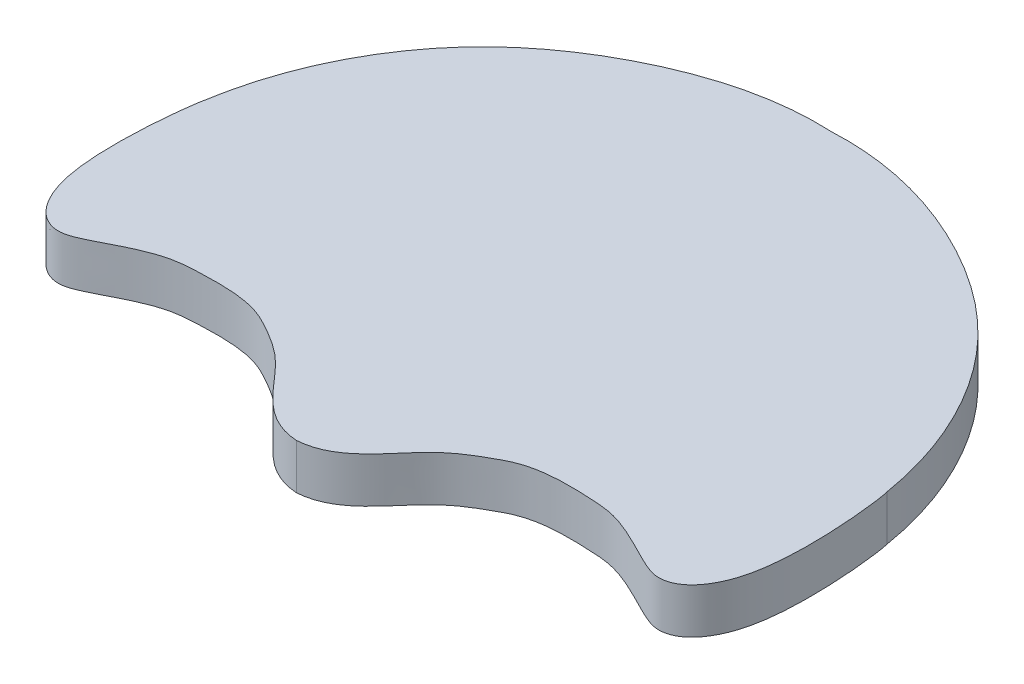
ISO-10303-21;
HEADER;
FILE_DESCRIPTION(('STEP AP214'),'2;1');
FILE_NAME('part.step','',(''),(''),'','','');
FILE_SCHEMA(('AUTOMOTIVE_DESIGN { 1 0 10303 214 1 1 1 1 }'));
ENDSEC;
DATA;
#1=APPLICATION_CONTEXT('core data for automotive mechanical design processes');
#2=APPLICATION_PROTOCOL_DEFINITION('international standard','automotive_design',2000,#1);
#3=PRODUCT_CONTEXT('',#1,'mechanical');
#4=PRODUCT('Part','Part','',(#3));
#5=PRODUCT_RELATED_PRODUCT_CATEGORY('part','',(#4));
#6=PRODUCT_DEFINITION_FORMATION('','',#4);
#7=PRODUCT_DEFINITION_CONTEXT('part definition',#1,'design');
#8=PRODUCT_DEFINITION('design','',#6,#7);
#9=PRODUCT_DEFINITION_SHAPE('','',#8);
#10=(LENGTH_UNIT() NAMED_UNIT(*) SI_UNIT(.MILLI.,.METRE.));
#11=(NAMED_UNIT(*) PLANE_ANGLE_UNIT() SI_UNIT($,.RADIAN.));
#12=(NAMED_UNIT(*) SI_UNIT($,.STERADIAN.) SOLID_ANGLE_UNIT());
#13=UNCERTAINTY_MEASURE_WITH_UNIT(LENGTH_MEASURE(1.E-05),#10,'distance_accuracy_value','');
#14=(GEOMETRIC_REPRESENTATION_CONTEXT(3) GLOBAL_UNCERTAINTY_ASSIGNED_CONTEXT((#13)) GLOBAL_UNIT_ASSIGNED_CONTEXT((#10,
#11,#12)) REPRESENTATION_CONTEXT('',''));
#15=CARTESIAN_POINT('',(0.,0.,0.));
#16=DIRECTION('',(0.,0.,1.));
#17=DIRECTION('',(1.,0.,0.));
#18=AXIS2_PLACEMENT_3D('',#15,#16,#17);
#19=CARTESIAN_POINT('',(-190.5,25.4,0.));
#20=CARTESIAN_POINT('',(-192.064011792662,25.4,4.96350192621509));
#21=CARTESIAN_POINT('',(-201.967167765924,25.4,83.3146183109833));
#22=CARTESIAN_POINT('',(-174.696602041029,25.4,109.289958804391));
#23=CARTESIAN_POINT('',(-151.630121659032,25.4,100.567984898405));
#24=CARTESIAN_POINT('',(-131.410771519055,25.4,87.7197839609674));
#25=CARTESIAN_POINT('',(-96.8435676275136,25.4,85.3754033772216));
#26=CARTESIAN_POINT('',(-78.6925101438482,25.4,86.2588274201763));
#27=CARTESIAN_POINT('',(-58.8335330715194,25.4,96.8793824699203));
#28=CARTESIAN_POINT('',(-37.3059346099107,25.4,109.935798161985));
#29=CARTESIAN_POINT('',(-21.3496139460233,25.4,139.114767456721));
#30=CARTESIAN_POINT('',(1.40754784340045E-13,25.4,140.530090072389));
#31=B_SPLINE_CURVE_WITH_KNOTS('',3,(#19,#20,#21,#22,#23,#24,#25,#26,#27,#28,#29,#30),
.UNSPECIFIED.,.F.,.F.,(4,1,1,1,1,1,1,1,1,4),(0.,0.166997051795611,0.292320514089622,
0.319633117373991,0.426735310498713,0.458914050276757,0.609241775376387,0.641909703937047,
0.766802370245909,1.),.UNSPECIFIED.);
#32=DIRECTION('',(0.,-1.,0.));
#33=VECTOR('',#32,1.);
#34=SURFACE_OF_LINEAR_EXTRUSION('',#31,#33);
#35=CARTESIAN_POINT('',(-190.5,0.,0.));
#36=CARTESIAN_POINT('',(-192.064011792662,0.,4.96350192621509));
#37=CARTESIAN_POINT('',(-201.967167765924,0.,83.3146183109833));
#38=CARTESIAN_POINT('',(-174.696602041029,0.,109.289958804391));
#39=CARTESIAN_POINT('',(-151.630121659032,0.,100.567984898405));
#40=CARTESIAN_POINT('',(-131.410771519055,0.,87.7197839609674));
#41=CARTESIAN_POINT('',(-96.8435676275136,0.,85.3754033772216));
#42=CARTESIAN_POINT('',(-78.6925101438482,0.,86.2588274201763));
#43=CARTESIAN_POINT('',(-58.8335330715194,0.,96.8793824699203));
#44=CARTESIAN_POINT('',(-37.3059346099107,0.,109.935798161985));
#45=CARTESIAN_POINT('',(-21.3496139460233,0.,139.114767456721));
#46=CARTESIAN_POINT('',(1.40754784340045E-13,0.,140.530090072389));
#47=B_SPLINE_CURVE_WITH_KNOTS('',3,(#35,#36,#37,#38,#39,#40,#41,#42,#43,#44,#45,#46),
.UNSPECIFIED.,.F.,.F.,(4,1,1,1,1,1,1,1,1,4),(0.,0.166997051795611,0.292320514089622,
0.319633117373991,0.426735310498713,0.458914050276757,0.609241775376387,0.641909703937047,
0.766802370245909,1.),.UNSPECIFIED.);
#48=CARTESIAN_POINT('',(-190.5,0.,0.));
#49=VERTEX_POINT('',#48);
#50=CARTESIAN_POINT('',(-1.06334839341837E-13,0.,140.530090072389));
#51=VERTEX_POINT('',#50);
#52=EDGE_CURVE('E134',#49,#51,#47,.T.);
#53=ORIENTED_EDGE('',*,*,#52,.T.);
#54=DIRECTION('',(0.,-1.,0.));
#55=VECTOR('',#54,1.);
#56=CARTESIAN_POINT('',(-1.06334839341837E-13,25.4,140.530090072389));
#57=LINE('',#56,#55);
#58=CARTESIAN_POINT('',(-1.06334839341837E-13,25.4,140.530090072389));
#59=VERTEX_POINT('',#58);
#60=EDGE_CURVE('E11',#59,#51,#57,.T.);
#61=ORIENTED_EDGE('',*,*,#60,.F.);
#62=CARTESIAN_POINT('',(-190.5,25.4,0.));
#63=VERTEX_POINT('',#62);
#64=EDGE_CURVE('E97',#63,#59,#31,.T.);
#65=ORIENTED_EDGE('',*,*,#64,.F.);
#66=DIRECTION('',(0.,-1.,0.));
#67=VECTOR('',#66,1.);
#68=CARTESIAN_POINT('',(-190.5,25.4,0.));
#69=LINE('',#68,#67);
#70=EDGE_CURVE('E105',#63,#49,#69,.T.);
#71=ORIENTED_EDGE('',*,*,#70,.T.);
#72=EDGE_LOOP('',(#53,#61,#65,#71));
#73=FACE_BOUND('',#72,.T.);
#74=ADVANCED_FACE('F45',(#73),#34,.F.);
#75=CARTESIAN_POINT('',(-1.06334839341837E-13,25.4,140.530090072389));
#76=CARTESIAN_POINT('',(21.3496139460233,25.4,139.114767456721));
#77=CARTESIAN_POINT('',(37.3059346099107,25.4,109.935798161984));
#78=CARTESIAN_POINT('',(58.8335330715195,25.4,96.8793824699203));
#79=CARTESIAN_POINT('',(78.6925101438482,25.4,86.2588274201763));
#80=CARTESIAN_POINT('',(96.8435676275136,25.4,85.3754033772216));
#81=CARTESIAN_POINT('',(131.410771519055,25.4,87.7197839609674));
#82=CARTESIAN_POINT('',(151.630121659032,25.4,100.567984898405));
#83=CARTESIAN_POINT('',(174.696602041029,25.4,109.289958804391));
#84=CARTESIAN_POINT('',(201.967167765924,25.4,83.3146183109832));
#85=CARTESIAN_POINT('',(192.064011792662,25.4,4.96350192621503));
#86=CARTESIAN_POINT('',(190.5,25.4,0.));
#87=B_SPLINE_CURVE_WITH_KNOTS('',3,(#75,#76,#77,#78,#79,#80,#81,#82,#83,#84,#85,#86),
.UNSPECIFIED.,.F.,.F.,(4,1,1,1,1,1,1,1,1,4),(0.,0.233197629754091,0.358090296062953,
0.390758224623613,0.541085949723243,0.573264689501287,0.680366882626009,0.707679485910378,
0.833002948204389,1.),.UNSPECIFIED.);
#88=DIRECTION('',(0.,-1.,0.));
#89=VECTOR('',#88,1.);
#90=SURFACE_OF_LINEAR_EXTRUSION('',#87,#89);
#91=CARTESIAN_POINT('',(-1.06334839341837E-13,0.,140.530090072389));
#92=CARTESIAN_POINT('',(21.3496139460233,0.,139.114767456721));
#93=CARTESIAN_POINT('',(37.3059346099107,0.,109.935798161984));
#94=CARTESIAN_POINT('',(58.8335330715195,0.,96.8793824699203));
#95=CARTESIAN_POINT('',(78.6925101438482,0.,86.2588274201763));
#96=CARTESIAN_POINT('',(96.8435676275136,0.,85.3754033772216));
#97=CARTESIAN_POINT('',(131.410771519055,0.,87.7197839609674));
#98=CARTESIAN_POINT('',(151.630121659032,0.,100.567984898405));
#99=CARTESIAN_POINT('',(174.696602041029,0.,109.289958804391));
#100=CARTESIAN_POINT('',(201.967167765924,0.,83.3146183109832));
#101=CARTESIAN_POINT('',(192.064011792662,0.,4.96350192621503));
#102=CARTESIAN_POINT('',(190.5,0.,0.));
#103=B_SPLINE_CURVE_WITH_KNOTS('',3,(#91,#92,#93,#94,#95,#96,#97,#98,#99,#100,#101,#102),
.UNSPECIFIED.,.F.,.F.,(4,1,1,1,1,1,1,1,1,4),(0.,0.233197629754091,0.358090296062953,
0.390758224623613,0.541085949723243,0.573264689501287,0.680366882626009,0.707679485910378,
0.833002948204389,1.),.UNSPECIFIED.);
#104=CARTESIAN_POINT('',(190.5,0.,0.));
#105=VERTEX_POINT('',#104);
#106=EDGE_CURVE('E101',#51,#105,#103,.T.);
#107=ORIENTED_EDGE('',*,*,#106,.T.);
#108=DIRECTION('',(0.,-1.,0.));
#109=VECTOR('',#108,1.);
#110=CARTESIAN_POINT('',(190.5,25.4,0.));
#111=LINE('',#110,#109);
#112=CARTESIAN_POINT('',(190.5,25.4,0.));
#113=VERTEX_POINT('',#112);
#114=EDGE_CURVE('E54',#113,#105,#111,.T.);
#115=ORIENTED_EDGE('',*,*,#114,.F.);
#116=EDGE_CURVE('E92',#59,#113,#87,.T.);
#117=ORIENTED_EDGE('',*,*,#116,.F.);
#118=ORIENTED_EDGE('',*,*,#60,.T.);
#119=EDGE_LOOP('',(#107,#115,#117,#118));
#120=FACE_BOUND('',#119,.T.);
#121=ADVANCED_FACE('F100',(#120),#90,.F.);
#122=CARTESIAN_POINT('',(190.5,25.4,0.));
#123=CARTESIAN_POINT('',(184.392726562295,25.4,-37.5370382365467));
#124=CARTESIAN_POINT('',(157.261289846749,25.4,-93.9640934852783));
#125=CARTESIAN_POINT('',(82.3874782016624,25.4,-146.622658841393));
#126=CARTESIAN_POINT('',(31.3113741429568,25.4,-160.799884185231));
#127=CARTESIAN_POINT('',(0.,25.4,-159.189909927611));
#128=B_SPLINE_CURVE_WITH_KNOTS('',3,(#122,#123,#124,#125,#126,#127),.UNSPECIFIED.,.F.,.F.,(4,1,
1,4),(0.,0.424401365551712,0.65636958095173,1.),.UNSPECIFIED.);
#129=DIRECTION('',(0.,-1.,0.));
#130=VECTOR('',#129,1.);
#131=SURFACE_OF_LINEAR_EXTRUSION('',#128,#130);
#132=CARTESIAN_POINT('',(190.5,0.,0.));
#133=CARTESIAN_POINT('',(184.392726562295,0.,-37.5370382365467));
#134=CARTESIAN_POINT('',(157.261289846749,0.,-93.9640934852783));
#135=CARTESIAN_POINT('',(82.3874782016624,0.,-146.622658841393));
#136=CARTESIAN_POINT('',(31.3113741429568,0.,-160.799884185231));
#137=CARTESIAN_POINT('',(0.,0.,-159.189909927611));
#138=B_SPLINE_CURVE_WITH_KNOTS('',3,(#132,#133,#134,#135,#136,#137),.UNSPECIFIED.,.F.,.F.,(4,1,
1,4),(0.,0.424401365551712,0.65636958095173,1.),.UNSPECIFIED.);
#139=CARTESIAN_POINT('',(0.,0.,-159.189909927611));
#140=VERTEX_POINT('',#139);
#141=EDGE_CURVE('E79',#105,#140,#138,.T.);
#142=ORIENTED_EDGE('',*,*,#141,.T.);
#143=DIRECTION('',(0.,-1.,0.));
#144=VECTOR('',#143,1.);
#145=CARTESIAN_POINT('',(0.,25.4,-159.189909927611));
#146=LINE('',#145,#144);
#147=CARTESIAN_POINT('',(0.,25.4,-159.189909927611));
#148=VERTEX_POINT('',#147);
#149=EDGE_CURVE('E102',#148,#140,#146,.T.);
#150=ORIENTED_EDGE('',*,*,#149,.F.);
#151=EDGE_CURVE('E95',#113,#148,#128,.T.);
#152=ORIENTED_EDGE('',*,*,#151,.F.);
#153=ORIENTED_EDGE('',*,*,#114,.T.);
#154=EDGE_LOOP('',(#142,#150,#152,#153));
#155=FACE_BOUND('',#154,.T.);
#156=ADVANCED_FACE('F103',(#155),#131,.F.);
#157=CARTESIAN_POINT('',(0.,25.4,-159.189909927611));
#158=CARTESIAN_POINT('',(-31.3113741429568,25.4,-160.799884185231));
#159=CARTESIAN_POINT('',(-82.3874782016624,25.4,-146.622658841393));
#160=CARTESIAN_POINT('',(-157.261289846749,25.4,-93.9640934852783));
#161=CARTESIAN_POINT('',(-184.392726562295,25.4,-37.5370382365467));
#162=CARTESIAN_POINT('',(-190.5,25.4,0.));
#163=B_SPLINE_CURVE_WITH_KNOTS('',3,(#157,#158,#159,#160,#161,#162),.UNSPECIFIED.,.F.,.F.,(4,1,
1,4),(0.,0.34363041904827,0.575598634448288,1.),.UNSPECIFIED.);
#164=DIRECTION('',(0.,-1.,0.));
#165=VECTOR('',#164,1.);
#166=SURFACE_OF_LINEAR_EXTRUSION('',#163,#165);
#167=CARTESIAN_POINT('',(0.,0.,-159.189909927611));
#168=CARTESIAN_POINT('',(-31.3113741429568,0.,-160.799884185231));
#169=CARTESIAN_POINT('',(-82.3874782016624,0.,-146.622658841393));
#170=CARTESIAN_POINT('',(-157.261289846749,0.,-93.9640934852783));
#171=CARTESIAN_POINT('',(-184.392726562295,0.,-37.5370382365467));
#172=CARTESIAN_POINT('',(-190.5,0.,0.));
#173=B_SPLINE_CURVE_WITH_KNOTS('',3,(#167,#168,#169,#170,#171,#172),.UNSPECIFIED.,.F.,.F.,(4,1,
1,4),(0.,0.34363041904827,0.575598634448288,1.),.UNSPECIFIED.);
#174=EDGE_CURVE('E85',#140,#49,#173,.T.);
#175=ORIENTED_EDGE('',*,*,#174,.T.);
#176=ORIENTED_EDGE('',*,*,#70,.F.);
#177=EDGE_CURVE('E62',#148,#63,#163,.T.);
#178=ORIENTED_EDGE('',*,*,#177,.F.);
#179=ORIENTED_EDGE('',*,*,#149,.T.);
#180=EDGE_LOOP('',(#175,#176,#178,#179));
#181=FACE_BOUND('',#180,.T.);
#182=ADVANCED_FACE('F123',(#181),#166,.F.);
#183=CARTESIAN_POINT('',(-98.1259130559372,25.4,86.0527308590208));
#184=DIRECTION('',(0.,-1.,0.));
#185=DIRECTION('',(0.,0.,-1.));
#186=AXIS2_PLACEMENT_3D('',#183,#184,#185);
#187=PLANE('',#186);
#188=ORIENTED_EDGE('',*,*,#64,.T.);
#189=ORIENTED_EDGE('',*,*,#116,.T.);
#190=ORIENTED_EDGE('',*,*,#151,.T.);
#191=ORIENTED_EDGE('',*,*,#177,.T.);
#192=EDGE_LOOP('',(#188,#189,#190,#191));
#193=FACE_BOUND('',#192,.T.);
#194=ADVANCED_FACE('F93',(#193),#187,.F.);
#195=CARTESIAN_POINT('',(-98.1259130559372,0.,86.0527308590208));
#196=DIRECTION('',(0.,-1.,0.));
#197=DIRECTION('',(0.,0.,-1.));
#198=AXIS2_PLACEMENT_3D('',#195,#196,#197);
#199=PLANE('',#198);
#200=ORIENTED_EDGE('',*,*,#52,.F.);
#201=ORIENTED_EDGE('',*,*,#174,.F.);
#202=ORIENTED_EDGE('',*,*,#141,.F.);
#203=ORIENTED_EDGE('',*,*,#106,.F.);
#204=EDGE_LOOP('',(#200,#201,#202,#203));
#205=FACE_BOUND('',#204,.T.);
#206=ADVANCED_FACE('F161',(#205),#199,.T.);
#207=CLOSED_SHELL('',(#74,#121,#156,#182,#194,#206));
#208=MANIFOLD_SOLID_BREP('B2',#207);
#209=ADVANCED_BREP_SHAPE_REPRESENTATION('',(#18,#208),#14);
#210=SHAPE_DEFINITION_REPRESENTATION(#9,#209);
ENDSEC;
END-ISO-10303-21;
